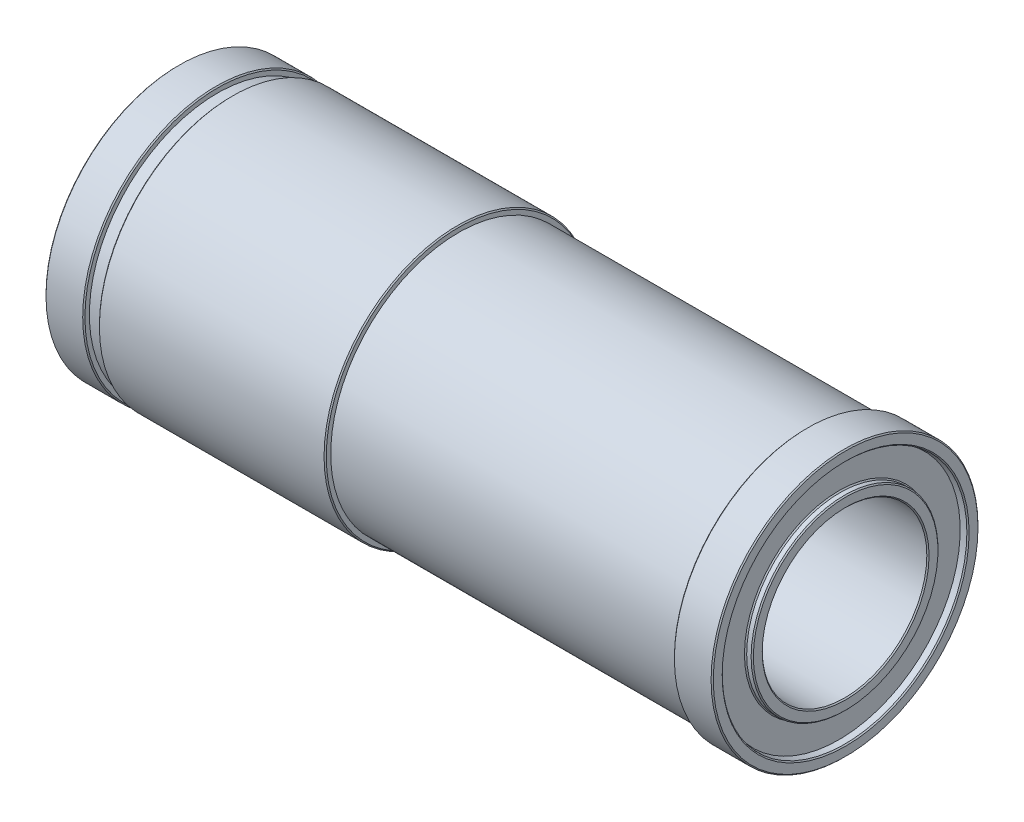
ISO-10303-21;
HEADER;
FILE_DESCRIPTION(('STEP AP214'),'2;1');
FILE_NAME('part.step','',(''),(''),'','','');
FILE_SCHEMA(('AUTOMOTIVE_DESIGN { 1 0 10303 214 1 1 1 1 }'));
ENDSEC;
DATA;
#1=APPLICATION_CONTEXT('core data for automotive mechanical design processes');
#2=APPLICATION_PROTOCOL_DEFINITION('international standard','automotive_design',2000,#1);
#3=PRODUCT_CONTEXT('',#1,'mechanical');
#4=PRODUCT('Part','Part','',(#3));
#5=PRODUCT_RELATED_PRODUCT_CATEGORY('part','',(#4));
#6=PRODUCT_DEFINITION_FORMATION('','',#4);
#7=PRODUCT_DEFINITION_CONTEXT('part definition',#1,'design');
#8=PRODUCT_DEFINITION('design','',#6,#7);
#9=PRODUCT_DEFINITION_SHAPE('','',#8);
#10=(LENGTH_UNIT() NAMED_UNIT(*) SI_UNIT(.MILLI.,.METRE.));
#11=(NAMED_UNIT(*) PLANE_ANGLE_UNIT() SI_UNIT($,.RADIAN.));
#12=(NAMED_UNIT(*) SI_UNIT($,.STERADIAN.) SOLID_ANGLE_UNIT());
#13=UNCERTAINTY_MEASURE_WITH_UNIT(LENGTH_MEASURE(1.E-05),#10,'distance_accuracy_value','');
#14=(GEOMETRIC_REPRESENTATION_CONTEXT(3) GLOBAL_UNCERTAINTY_ASSIGNED_CONTEXT((#13)) GLOBAL_UNIT_ASSIGNED_CONTEXT((#10,
#11,#12)) REPRESENTATION_CONTEXT('',''));
#15=CARTESIAN_POINT('',(0.,0.,0.));
#16=DIRECTION('',(0.,0.,1.));
#17=DIRECTION('',(1.,0.,0.));
#18=AXIS2_PLACEMENT_3D('',#15,#16,#17);
#19=CARTESIAN_POINT('',(0.,-3.00000000002488,0.));
#20=DIRECTION('',(-1.,0.,0.));
#21=DIRECTION('',(0.,0.,1.));
#22=AXIS2_PLACEMENT_3D('',#19,#20,#21);
#23=CONICAL_SURFACE('',#22,7.5,0.785398163397435);
#24=CARTESIAN_POINT('',(0.0999999998896328,-3.00000000002488,0.));
#25=DIRECTION('',(-1.,0.,0.));
#26=DIRECTION('',(0.,0.,1.));
#27=AXIS2_PLACEMENT_3D('',#24,#25,#26);
#28=CIRCLE('',#27,7.40000000011037);
#29=CARTESIAN_POINT('',(0.0999999998896328,-3.00000000002488,7.40000000011037));
#30=VERTEX_POINT('',#29);
#31=EDGE_CURVE('E91',#30,#30,#28,.T.);
#32=ORIENTED_EDGE('',*,*,#31,.F.);
#33=EDGE_LOOP('',(#32));
#34=FACE_BOUND('',#33,.T.);
#35=CARTESIAN_POINT('',(0.,-3.00000000002488,0.));
#36=DIRECTION('',(-1.,0.,0.));
#37=DIRECTION('',(0.,0.,1.));
#38=AXIS2_PLACEMENT_3D('',#35,#36,#37);
#39=CIRCLE('',#38,7.5);
#40=CARTESIAN_POINT('',(0.,-3.00000000002488,7.5));
#41=VERTEX_POINT('',#40);
#42=EDGE_CURVE('E11',#41,#41,#39,.T.);
#43=ORIENTED_EDGE('',*,*,#42,.T.);
#44=EDGE_LOOP('',(#43));
#45=FACE_BOUND('',#44,.T.);
#46=ADVANCED_FACE('F45',(#34,#45),#23,.F.);
#47=CARTESIAN_POINT('',(0.,4.49999999997512,0.));
#48=DIRECTION('',(1.,0.,0.));
#49=DIRECTION('',(0.,0.,-1.));
#50=AXIS2_PLACEMENT_3D('',#47,#48,#49);
#51=PLANE('',#50);
#52=ORIENTED_EDGE('',*,*,#42,.F.);
#53=EDGE_LOOP('',(#52));
#54=FACE_BOUND('',#53,.T.);
#55=CARTESIAN_POINT('',(0.,-3.00000000002488,0.));
#56=DIRECTION('',(-1.,0.,0.));
#57=DIRECTION('',(0.,0.,1.));
#58=AXIS2_PLACEMENT_3D('',#55,#56,#57);
#59=CIRCLE('',#58,8.30000000002656);
#60=CARTESIAN_POINT('',(0.,-3.00000000002488,8.30000000002656));
#61=VERTEX_POINT('',#60);
#62=EDGE_CURVE('E51',#61,#61,#59,.T.);
#63=ORIENTED_EDGE('',*,*,#62,.T.);
#64=EDGE_LOOP('',(#63));
#65=FACE_BOUND('',#64,.T.);
#66=ADVANCED_FACE('F98',(#54,#65),#51,.F.);
#67=CARTESIAN_POINT('',(0.10000000001336,-3.00000000002488,0.));
#68=DIRECTION('',(1.,0.,0.));
#69=DIRECTION('',(0.,0.,-1.));
#70=AXIS2_PLACEMENT_3D('',#67,#68,#69);
#71=CONICAL_SURFACE('',#70,8.40000000003992,0.785398163397466);
#72=ORIENTED_EDGE('',*,*,#62,.F.);
#73=EDGE_LOOP('',(#72));
#74=FACE_BOUND('',#73,.T.);
#75=CARTESIAN_POINT('',(0.10000000001336,-3.00000000002488,0.));
#76=DIRECTION('',(-1.,0.,0.));
#77=DIRECTION('',(0.,0.,1.));
#78=AXIS2_PLACEMENT_3D('',#75,#76,#77);
#79=CIRCLE('',#78,8.40000000003992);
#80=CARTESIAN_POINT('',(0.10000000001336,-3.00000000002488,8.40000000003992));
#81=VERTEX_POINT('',#80);
#82=EDGE_CURVE('E55',#81,#81,#79,.T.);
#83=ORIENTED_EDGE('',*,*,#82,.T.);
#84=EDGE_LOOP('',(#83));
#85=FACE_BOUND('',#84,.T.);
#86=ADVANCED_FACE('F102',(#74,#85),#71,.T.);
#87=CARTESIAN_POINT('',(30.,-3.00000000002488,0.));
#88=DIRECTION('',(-1.,0.,0.));
#89=DIRECTION('',(0.,0.,1.));
#90=AXIS2_PLACEMENT_3D('',#87,#88,#89);
#91=CYLINDRICAL_SURFACE('',#90,8.40000000003992);
#92=ORIENTED_EDGE('',*,*,#82,.F.);
#93=EDGE_LOOP('',(#92));
#94=FACE_BOUND('',#93,.T.);
#95=CARTESIAN_POINT('',(0.500000000013379,-3.00000000002488,0.));
#96=DIRECTION('',(-1.,0.,0.));
#97=DIRECTION('',(0.,0.,1.));
#98=AXIS2_PLACEMENT_3D('',#95,#96,#97);
#99=CIRCLE('',#98,8.40000000003992);
#100=CARTESIAN_POINT('',(0.500000000013379,-3.00000000002488,8.40000000003992));
#101=VERTEX_POINT('',#100);
#102=EDGE_CURVE('E59',#101,#101,#99,.T.);
#103=ORIENTED_EDGE('',*,*,#102,.T.);
#104=EDGE_LOOP('',(#103));
#105=FACE_BOUND('',#104,.T.);
#106=ADVANCED_FACE('F107',(#94,#105),#91,.T.);
#107=CARTESIAN_POINT('',(0.600000000013375,-3.00000000002488,0.));
#108=DIRECTION('',(1.,0.,0.));
#109=DIRECTION('',(0.,0.,-1.));
#110=AXIS2_PLACEMENT_3D('',#107,#108,#109);
#111=CONICAL_SURFACE('',#110,8.50000000003992,0.785398163397448);
#112=ORIENTED_EDGE('',*,*,#102,.F.);
#113=EDGE_LOOP('',(#112));
#114=FACE_BOUND('',#113,.T.);
#115=CARTESIAN_POINT('',(0.600000000013375,-3.00000000002488,0.));
#116=DIRECTION('',(-1.,0.,0.));
#117=DIRECTION('',(0.,0.,1.));
#118=AXIS2_PLACEMENT_3D('',#115,#116,#117);
#119=CIRCLE('',#118,8.50000000003992);
#120=CARTESIAN_POINT('',(0.600000000013375,-3.00000000002488,8.50000000003992));
#121=VERTEX_POINT('',#120);
#122=EDGE_CURVE('E64',#121,#121,#119,.T.);
#123=ORIENTED_EDGE('',*,*,#122,.T.);
#124=EDGE_LOOP('',(#123));
#125=FACE_BOUND('',#124,.T.);
#126=ADVANCED_FACE('F113',(#114,#125),#111,.T.);
#127=CARTESIAN_POINT('',(0.600000000013375,5.50000000001504,0.));
#128=DIRECTION('',(1.,0.,0.));
#129=DIRECTION('',(0.,0.,-1.));
#130=AXIS2_PLACEMENT_3D('',#127,#128,#129);
#131=PLANE('',#130);
#132=ORIENTED_EDGE('',*,*,#122,.F.);
#133=EDGE_LOOP('',(#132));
#134=FACE_BOUND('',#133,.T.);
#135=CARTESIAN_POINT('',(0.600000000013375,-3.00000000002488,0.));
#136=DIRECTION('',(-1.,0.,0.));
#137=DIRECTION('',(0.,0.,1.));
#138=AXIS2_PLACEMENT_3D('',#135,#136,#137);
#139=CIRCLE('',#138,10.9000000000249);
#140=CARTESIAN_POINT('',(0.600000000013375,-3.00000000002488,10.9000000000249));
#141=VERTEX_POINT('',#140);
#142=EDGE_CURVE('E67',#141,#141,#139,.T.);
#143=ORIENTED_EDGE('',*,*,#142,.T.);
#144=EDGE_LOOP('',(#143));
#145=FACE_BOUND('',#144,.T.);
#146=ADVANCED_FACE('F117',(#134,#145),#131,.F.);
#147=CARTESIAN_POINT('',(30.,-3.00000000002488,0.));
#148=DIRECTION('',(-1.,0.,0.));
#149=DIRECTION('',(0.,0.,1.));
#150=AXIS2_PLACEMENT_3D('',#147,#148,#149);
#151=CYLINDRICAL_SURFACE('',#150,10.9000000000249);
#152=ORIENTED_EDGE('',*,*,#142,.F.);
#153=EDGE_LOOP('',(#152));
#154=FACE_BOUND('',#153,.T.);
#155=CARTESIAN_POINT('',(59.3999999998077,-3.00000000002488,0.));
#156=DIRECTION('',(-1.,0.,0.));
#157=DIRECTION('',(0.,0.,1.));
#158=AXIS2_PLACEMENT_3D('',#155,#156,#157);
#159=CIRCLE('',#158,10.9000000000249);
#160=CARTESIAN_POINT('',(59.3999999998077,-3.00000000002488,10.9000000000249));
#161=VERTEX_POINT('',#160);
#162=EDGE_CURVE('E70',#161,#161,#159,.T.);
#163=ORIENTED_EDGE('',*,*,#162,.T.);
#164=EDGE_LOOP('',(#163));
#165=FACE_BOUND('',#164,.T.);
#166=ADVANCED_FACE('F121',(#154,#165),#151,.T.);
#167=CARTESIAN_POINT('',(59.3999999998077,7.9,0.));
#168=DIRECTION('',(-1.,0.,0.));
#169=DIRECTION('',(0.,0.,1.));
#170=AXIS2_PLACEMENT_3D('',#167,#168,#169);
#171=PLANE('',#170);
#172=ORIENTED_EDGE('',*,*,#162,.F.);
#173=EDGE_LOOP('',(#172));
#174=FACE_BOUND('',#173,.T.);
#175=CARTESIAN_POINT('',(59.3999999998077,-3.00000000002488,0.));
#176=DIRECTION('',(-1.,0.,0.));
#177=DIRECTION('',(0.,0.,1.));
#178=AXIS2_PLACEMENT_3D('',#175,#176,#177);
#179=CIRCLE('',#178,8.50000000002487);
#180=CARTESIAN_POINT('',(59.3999999998077,-3.00000000002488,8.50000000002487));
#181=VERTEX_POINT('',#180);
#182=EDGE_CURVE('E73',#181,#181,#179,.T.);
#183=ORIENTED_EDGE('',*,*,#182,.T.);
#184=EDGE_LOOP('',(#183));
#185=FACE_BOUND('',#184,.T.);
#186=ADVANCED_FACE('F125',(#174,#185),#171,.F.);
#187=CARTESIAN_POINT('',(59.4999999998077,-3.00000000002488,0.));
#188=DIRECTION('',(-1.,0.,0.));
#189=DIRECTION('',(0.,0.,1.));
#190=AXIS2_PLACEMENT_3D('',#187,#188,#189);
#191=CONICAL_SURFACE('',#190,8.40000000002487,0.785398163397466);
#192=ORIENTED_EDGE('',*,*,#182,.F.);
#193=EDGE_LOOP('',(#192));
#194=FACE_BOUND('',#193,.T.);
#195=CARTESIAN_POINT('',(59.4999999998077,-3.00000000002488,0.));
#196=DIRECTION('',(-1.,0.,0.));
#197=DIRECTION('',(0.,0.,1.));
#198=AXIS2_PLACEMENT_3D('',#195,#196,#197);
#199=CIRCLE('',#198,8.40000000002487);
#200=CARTESIAN_POINT('',(59.4999999998077,-3.00000000002488,8.40000000002487));
#201=VERTEX_POINT('',#200);
#202=EDGE_CURVE('E76',#201,#201,#199,.T.);
#203=ORIENTED_EDGE('',*,*,#202,.T.);
#204=EDGE_LOOP('',(#203));
#205=FACE_BOUND('',#204,.T.);
#206=ADVANCED_FACE('F129',(#194,#205),#191,.T.);
#207=CARTESIAN_POINT('',(30.,-3.00000000002488,0.));
#208=DIRECTION('',(-1.,0.,0.));
#209=DIRECTION('',(0.,0.,1.));
#210=AXIS2_PLACEMENT_3D('',#207,#208,#209);
#211=CYLINDRICAL_SURFACE('',#210,8.40000000002487);
#212=ORIENTED_EDGE('',*,*,#202,.F.);
#213=EDGE_LOOP('',(#212));
#214=FACE_BOUND('',#213,.T.);
#215=CARTESIAN_POINT('',(59.8999999998077,-3.00000000002488,0.));
#216=DIRECTION('',(-1.,0.,0.));
#217=DIRECTION('',(0.,0.,1.));
#218=AXIS2_PLACEMENT_3D('',#215,#216,#217);
#219=CIRCLE('',#218,8.40000000002487);
#220=CARTESIAN_POINT('',(59.8999999998077,-3.00000000002488,8.40000000002487));
#221=VERTEX_POINT('',#220);
#222=EDGE_CURVE('E79',#221,#221,#219,.T.);
#223=ORIENTED_EDGE('',*,*,#222,.T.);
#224=EDGE_LOOP('',(#223));
#225=FACE_BOUND('',#224,.T.);
#226=ADVANCED_FACE('F133',(#214,#225),#211,.T.);
#227=CARTESIAN_POINT('',(59.9999999998077,-3.00000000002488,0.));
#228=DIRECTION('',(-1.,0.,0.));
#229=DIRECTION('',(0.,0.,1.));
#230=AXIS2_PLACEMENT_3D('',#227,#228,#229);
#231=CONICAL_SURFACE('',#230,8.30000000002488,0.785398163397431);
#232=ORIENTED_EDGE('',*,*,#222,.F.);
#233=EDGE_LOOP('',(#232));
#234=FACE_BOUND('',#233,.T.);
#235=CARTESIAN_POINT('',(59.9999999998077,-3.00000000002488,0.));
#236=DIRECTION('',(-1.,0.,0.));
#237=DIRECTION('',(0.,0.,1.));
#238=AXIS2_PLACEMENT_3D('',#235,#236,#237);
#239=CIRCLE('',#238,8.30000000002488);
#240=CARTESIAN_POINT('',(59.9999999998077,-3.00000000002488,8.30000000002488));
#241=VERTEX_POINT('',#240);
#242=EDGE_CURVE('E82',#241,#241,#239,.T.);
#243=ORIENTED_EDGE('',*,*,#242,.T.);
#244=EDGE_LOOP('',(#243));
#245=FACE_BOUND('',#244,.T.);
#246=ADVANCED_FACE('F137',(#234,#245),#231,.T.);
#247=CARTESIAN_POINT('',(59.9999999998077,5.3,0.));
#248=DIRECTION('',(-1.,0.,0.));
#249=DIRECTION('',(0.,0.,1.));
#250=AXIS2_PLACEMENT_3D('',#247,#248,#249);
#251=PLANE('',#250);
#252=ORIENTED_EDGE('',*,*,#242,.F.);
#253=EDGE_LOOP('',(#252));
#254=FACE_BOUND('',#253,.T.);
#255=CARTESIAN_POINT('',(59.9999999998077,-3.00000000002488,0.));
#256=DIRECTION('',(-1.,0.,0.));
#257=DIRECTION('',(0.,0.,1.));
#258=AXIS2_PLACEMENT_3D('',#255,#256,#257);
#259=CIRCLE('',#258,7.50000000002842);
#260=CARTESIAN_POINT('',(59.9999999998077,-3.00000000002488,7.50000000002842));
#261=VERTEX_POINT('',#260);
#262=EDGE_CURVE('E85',#261,#261,#259,.T.);
#263=ORIENTED_EDGE('',*,*,#262,.T.);
#264=EDGE_LOOP('',(#263));
#265=FACE_BOUND('',#264,.T.);
#266=ADVANCED_FACE('F141',(#254,#265),#251,.F.);
#267=CARTESIAN_POINT('',(59.8999999998896,-3.00000000002488,0.));
#268=DIRECTION('',(1.,0.,0.));
#269=DIRECTION('',(0.,0.,-1.));
#270=AXIS2_PLACEMENT_3D('',#267,#268,#269);
#271=CONICAL_SURFACE('',#270,7.40000000011036,0.78539816339744);
#272=ORIENTED_EDGE('',*,*,#262,.F.);
#273=EDGE_LOOP('',(#272));
#274=FACE_BOUND('',#273,.T.);
#275=CARTESIAN_POINT('',(59.8999999998896,-3.00000000002488,0.));
#276=DIRECTION('',(-1.,0.,0.));
#277=DIRECTION('',(0.,0.,1.));
#278=AXIS2_PLACEMENT_3D('',#275,#276,#277);
#279=CIRCLE('',#278,7.40000000011036);
#280=CARTESIAN_POINT('',(59.8999999998896,-3.00000000002488,7.40000000011036));
#281=VERTEX_POINT('',#280);
#282=EDGE_CURVE('E88',#281,#281,#279,.T.);
#283=ORIENTED_EDGE('',*,*,#282,.T.);
#284=EDGE_LOOP('',(#283));
#285=FACE_BOUND('',#284,.T.);
#286=ADVANCED_FACE('F145',(#274,#285),#271,.F.);
#287=CARTESIAN_POINT('',(30.,-3.00000000002488,0.));
#288=DIRECTION('',(-1.,0.,0.));
#289=DIRECTION('',(0.,0.,1.));
#290=AXIS2_PLACEMENT_3D('',#287,#288,#289);
#291=CYLINDRICAL_SURFACE('',#290,7.40000000011037);
#292=ORIENTED_EDGE('',*,*,#282,.F.);
#293=EDGE_LOOP('',(#292));
#294=FACE_BOUND('',#293,.T.);
#295=ORIENTED_EDGE('',*,*,#31,.T.);
#296=EDGE_LOOP('',(#295));
#297=FACE_BOUND('',#296,.T.);
#298=ADVANCED_FACE('F95',(#294,#297),#291,.F.);
#299=CLOSED_SHELL('',(#46,#66,#86,#106,#126,#146,#166,#186,#206,#226,#246,#266,#286,#298));
#300=MANIFOLD_SOLID_BREP('B2',#299);
#301=CARTESIAN_POINT('',(25.2,8.5,0.));
#302=DIRECTION('',(1.,0.,0.));
#303=DIRECTION('',(0.,0.,-1.));
#304=AXIS2_PLACEMENT_3D('',#301,#302,#303);
#305=PLANE('',#304);
#306=CARTESIAN_POINT('',(25.2,-3.,0.));
#307=DIRECTION('',(1.,0.,0.));
#308=DIRECTION('',(0.,0.,-1.));
#309=AXIS2_PLACEMENT_3D('',#306,#307,#308);
#310=CIRCLE('',#309,11.9);
#311=CARTESIAN_POINT('',(25.2,-3.,-11.9));
#312=VERTEX_POINT('',#311);
#313=EDGE_CURVE('E44',#312,#312,#310,.T.);
#314=ORIENTED_EDGE('',*,*,#313,.T.);
#315=EDGE_LOOP('',(#314));
#316=FACE_BOUND('',#315,.T.);
#317=CARTESIAN_POINT('',(25.2,-3.,0.));
#318=DIRECTION('',(1.,0.,0.));
#319=DIRECTION('',(0.,0.,-1.));
#320=AXIS2_PLACEMENT_3D('',#317,#318,#319);
#321=CIRCLE('',#320,11.5);
#322=CARTESIAN_POINT('',(25.2,-3.,-11.5));
#323=VERTEX_POINT('',#322);
#324=EDGE_CURVE('E318',#323,#323,#321,.T.);
#325=ORIENTED_EDGE('',*,*,#324,.F.);
#326=EDGE_LOOP('',(#325));
#327=FACE_BOUND('',#326,.T.);
#328=ADVANCED_FACE('F257',(#316,#327),#305,.T.);
#329=CARTESIAN_POINT('',(25.2,-3.,0.));
#330=DIRECTION('',(-1.,0.,0.));
#331=DIRECTION('',(0.,0.,1.));
#332=AXIS2_PLACEMENT_3D('',#329,#330,#331);
#333=CONICAL_SURFACE('',#332,11.9,0.785398163397466);
#334=CARTESIAN_POINT('',(25.1,-3.,0.));
#335=DIRECTION('',(1.,0.,0.));
#336=DIRECTION('',(0.,0.,-1.));
#337=AXIS2_PLACEMENT_3D('',#334,#335,#336);
#338=CIRCLE('',#337,12.);
#339=CARTESIAN_POINT('',(25.1,-3.,-12.));
#340=VERTEX_POINT('',#339);
#341=EDGE_CURVE('E263',#340,#340,#338,.T.);
#342=ORIENTED_EDGE('',*,*,#341,.T.);
#343=EDGE_LOOP('',(#342));
#344=FACE_BOUND('',#343,.T.);
#345=ORIENTED_EDGE('',*,*,#313,.F.);
#346=EDGE_LOOP('',(#345));
#347=FACE_BOUND('',#346,.T.);
#348=ADVANCED_FACE('F326',(#344,#347),#333,.T.);
#349=CARTESIAN_POINT('',(0.,-3.,0.));
#350=DIRECTION('',(1.,0.,0.));
#351=DIRECTION('',(0.,0.,-1.));
#352=AXIS2_PLACEMENT_3D('',#349,#350,#351);
#353=CYLINDRICAL_SURFACE('',#352,12.);
#354=CARTESIAN_POINT('',(4.89999999999999,-3.,0.));
#355=DIRECTION('',(1.,0.,0.));
#356=DIRECTION('',(0.,0.,-1.));
#357=AXIS2_PLACEMENT_3D('',#354,#355,#356);
#358=CIRCLE('',#357,12.);
#359=CARTESIAN_POINT('',(4.89999999999999,-3.,-12.));
#360=VERTEX_POINT('',#359);
#361=EDGE_CURVE('E267',#360,#360,#358,.T.);
#362=ORIENTED_EDGE('',*,*,#361,.T.);
#363=EDGE_LOOP('',(#362));
#364=FACE_BOUND('',#363,.T.);
#365=ORIENTED_EDGE('',*,*,#341,.F.);
#366=EDGE_LOOP('',(#365));
#367=FACE_BOUND('',#366,.T.);
#368=ADVANCED_FACE('F330',(#364,#367),#353,.T.);
#369=CARTESIAN_POINT('',(4.89999999999999,-3.,0.));
#370=DIRECTION('',(1.,0.,0.));
#371=DIRECTION('',(0.,0.,-1.));
#372=AXIS2_PLACEMENT_3D('',#369,#370,#371);
#373=CONICAL_SURFACE('',#372,12.,0.78539816339744);
#374=CARTESIAN_POINT('',(4.8,-3.,0.));
#375=DIRECTION('',(1.,0.,0.));
#376=DIRECTION('',(0.,0.,-1.));
#377=AXIS2_PLACEMENT_3D('',#374,#375,#376);
#378=CIRCLE('',#377,11.9);
#379=CARTESIAN_POINT('',(4.8,-3.,-11.9));
#380=VERTEX_POINT('',#379);
#381=EDGE_CURVE('E271',#380,#380,#378,.T.);
#382=ORIENTED_EDGE('',*,*,#381,.T.);
#383=EDGE_LOOP('',(#382));
#384=FACE_BOUND('',#383,.T.);
#385=ORIENTED_EDGE('',*,*,#361,.F.);
#386=EDGE_LOOP('',(#385));
#387=FACE_BOUND('',#386,.T.);
#388=ADVANCED_FACE('F334',(#384,#387),#373,.T.);
#389=CARTESIAN_POINT('',(4.8,8.90000000000001,0.));
#390=DIRECTION('',(-1.,0.,0.));
#391=DIRECTION('',(0.,0.,1.));
#392=AXIS2_PLACEMENT_3D('',#389,#390,#391);
#393=PLANE('',#392);
#394=CARTESIAN_POINT('',(4.8,-3.,0.));
#395=DIRECTION('',(1.,0.,0.));
#396=DIRECTION('',(0.,0.,-1.));
#397=AXIS2_PLACEMENT_3D('',#394,#395,#396);
#398=CIRCLE('',#397,11.5);
#399=CARTESIAN_POINT('',(4.8,-3.,-11.5));
#400=VERTEX_POINT('',#399);
#401=EDGE_CURVE('E276',#400,#400,#398,.T.);
#402=ORIENTED_EDGE('',*,*,#401,.T.);
#403=EDGE_LOOP('',(#402));
#404=FACE_BOUND('',#403,.T.);
#405=ORIENTED_EDGE('',*,*,#381,.F.);
#406=EDGE_LOOP('',(#405));
#407=FACE_BOUND('',#406,.T.);
#408=ADVANCED_FACE('F341',(#404,#407),#393,.T.);
#409=CARTESIAN_POINT('',(0.,-3.,0.));
#410=DIRECTION('',(1.,0.,0.));
#411=DIRECTION('',(0.,0.,-1.));
#412=AXIS2_PLACEMENT_3D('',#409,#410,#411);
#413=CYLINDRICAL_SURFACE('',#412,11.5);
#414=CARTESIAN_POINT('',(3.5,-3.,0.));
#415=DIRECTION('',(1.,0.,0.));
#416=DIRECTION('',(0.,0.,-1.));
#417=AXIS2_PLACEMENT_3D('',#414,#415,#416);
#418=CIRCLE('',#417,11.5);
#419=CARTESIAN_POINT('',(3.5,-3.,-11.5));
#420=VERTEX_POINT('',#419);
#421=EDGE_CURVE('E279',#420,#420,#418,.T.);
#422=ORIENTED_EDGE('',*,*,#421,.T.);
#423=EDGE_LOOP('',(#422));
#424=FACE_BOUND('',#423,.T.);
#425=ORIENTED_EDGE('',*,*,#401,.F.);
#426=EDGE_LOOP('',(#425));
#427=FACE_BOUND('',#426,.T.);
#428=ADVANCED_FACE('F345',(#424,#427),#413,.T.);
#429=CARTESIAN_POINT('',(3.5,8.5,0.));
#430=DIRECTION('',(1.,0.,0.));
#431=DIRECTION('',(0.,0.,-1.));
#432=AXIS2_PLACEMENT_3D('',#429,#430,#431);
#433=PLANE('',#432);
#434=CARTESIAN_POINT('',(3.5,-3.,0.));
#435=DIRECTION('',(1.,0.,0.));
#436=DIRECTION('',(0.,0.,-1.));
#437=AXIS2_PLACEMENT_3D('',#434,#435,#436);
#438=CIRCLE('',#437,11.9);
#439=CARTESIAN_POINT('',(3.5,-3.,-11.9));
#440=VERTEX_POINT('',#439);
#441=EDGE_CURVE('E282',#440,#440,#438,.T.);
#442=ORIENTED_EDGE('',*,*,#441,.T.);
#443=EDGE_LOOP('',(#442));
#444=FACE_BOUND('',#443,.T.);
#445=ORIENTED_EDGE('',*,*,#421,.F.);
#446=EDGE_LOOP('',(#445));
#447=FACE_BOUND('',#446,.T.);
#448=ADVANCED_FACE('F349',(#444,#447),#433,.T.);
#449=CARTESIAN_POINT('',(3.5,-3.,0.));
#450=DIRECTION('',(-1.,0.,0.));
#451=DIRECTION('',(0.,0.,1.));
#452=AXIS2_PLACEMENT_3D('',#449,#450,#451);
#453=CONICAL_SURFACE('',#452,11.9,0.785398163397446);
#454=CARTESIAN_POINT('',(3.4,-3.,0.));
#455=DIRECTION('',(1.,0.,0.));
#456=DIRECTION('',(0.,0.,-1.));
#457=AXIS2_PLACEMENT_3D('',#454,#455,#456);
#458=CIRCLE('',#457,12.);
#459=CARTESIAN_POINT('',(3.4,-3.,-12.));
#460=VERTEX_POINT('',#459);
#461=EDGE_CURVE('E285',#460,#460,#458,.T.);
#462=ORIENTED_EDGE('',*,*,#461,.T.);
#463=EDGE_LOOP('',(#462));
#464=FACE_BOUND('',#463,.T.);
#465=ORIENTED_EDGE('',*,*,#441,.F.);
#466=EDGE_LOOP('',(#465));
#467=FACE_BOUND('',#466,.T.);
#468=ADVANCED_FACE('F353',(#464,#467),#453,.T.);
#469=CARTESIAN_POINT('',(0.,-3.,0.));
#470=DIRECTION('',(1.,0.,0.));
#471=DIRECTION('',(0.,0.,-1.));
#472=AXIS2_PLACEMENT_3D('',#469,#470,#471);
#473=CYLINDRICAL_SURFACE('',#472,12.);
#474=CARTESIAN_POINT('',(0.0999999999999946,-3.,0.));
#475=DIRECTION('',(1.,0.,0.));
#476=DIRECTION('',(0.,0.,-1.));
#477=AXIS2_PLACEMENT_3D('',#474,#475,#476);
#478=CIRCLE('',#477,12.);
#479=CARTESIAN_POINT('',(0.0999999999999946,-3.,-12.));
#480=VERTEX_POINT('',#479);
#481=EDGE_CURVE('E288',#480,#480,#478,.T.);
#482=ORIENTED_EDGE('',*,*,#481,.T.);
#483=EDGE_LOOP('',(#482));
#484=FACE_BOUND('',#483,.T.);
#485=ORIENTED_EDGE('',*,*,#461,.F.);
#486=EDGE_LOOP('',(#485));
#487=FACE_BOUND('',#486,.T.);
#488=ADVANCED_FACE('F357',(#484,#487),#473,.T.);
#489=CARTESIAN_POINT('',(0.0999999999999946,-3.,0.));
#490=DIRECTION('',(1.,0.,0.));
#491=DIRECTION('',(0.,0.,-1.));
#492=AXIS2_PLACEMENT_3D('',#489,#490,#491);
#493=CONICAL_SURFACE('',#492,12.,0.785398163397454);
#494=CARTESIAN_POINT('',(0.,-3.,0.));
#495=DIRECTION('',(1.,0.,0.));
#496=DIRECTION('',(0.,0.,-1.));
#497=AXIS2_PLACEMENT_3D('',#494,#495,#496);
#498=CIRCLE('',#497,11.9);
#499=CARTESIAN_POINT('',(0.,-3.,-11.9));
#500=VERTEX_POINT('',#499);
#501=EDGE_CURVE('E291',#500,#500,#498,.T.);
#502=ORIENTED_EDGE('',*,*,#501,.T.);
#503=EDGE_LOOP('',(#502));
#504=FACE_BOUND('',#503,.T.);
#505=ORIENTED_EDGE('',*,*,#481,.F.);
#506=EDGE_LOOP('',(#505));
#507=FACE_BOUND('',#506,.T.);
#508=ADVANCED_FACE('F361',(#504,#507),#493,.T.);
#509=CARTESIAN_POINT('',(0.,8.9,0.));
#510=DIRECTION('',(-1.,0.,0.));
#511=DIRECTION('',(0.,0.,1.));
#512=AXIS2_PLACEMENT_3D('',#509,#510,#511);
#513=PLANE('',#512);
#514=CARTESIAN_POINT('',(0.,-3.,0.));
#515=DIRECTION('',(1.,0.,0.));
#516=DIRECTION('',(0.,0.,-1.));
#517=AXIS2_PLACEMENT_3D('',#514,#515,#516);
#518=CIRCLE('',#517,11.);
#519=CARTESIAN_POINT('',(0.,-3.,-11.));
#520=VERTEX_POINT('',#519);
#521=EDGE_CURVE('E294',#520,#520,#518,.T.);
#522=ORIENTED_EDGE('',*,*,#521,.T.);
#523=EDGE_LOOP('',(#522));
#524=FACE_BOUND('',#523,.T.);
#525=ORIENTED_EDGE('',*,*,#501,.F.);
#526=EDGE_LOOP('',(#525));
#527=FACE_BOUND('',#526,.T.);
#528=ADVANCED_FACE('F365',(#524,#527),#513,.T.);
#529=CARTESIAN_POINT('',(0.,-3.,0.));
#530=DIRECTION('',(1.,0.,0.));
#531=DIRECTION('',(0.,0.,-1.));
#532=AXIS2_PLACEMENT_3D('',#529,#530,#531);
#533=CYLINDRICAL_SURFACE('',#532,11.);
#534=CARTESIAN_POINT('',(59.9,-3.,0.));
#535=DIRECTION('',(1.,0.,0.));
#536=DIRECTION('',(0.,0.,-1.));
#537=AXIS2_PLACEMENT_3D('',#534,#535,#536);
#538=CIRCLE('',#537,11.);
#539=CARTESIAN_POINT('',(59.9,-3.,-11.));
#540=VERTEX_POINT('',#539);
#541=EDGE_CURVE('E297',#540,#540,#538,.T.);
#542=ORIENTED_EDGE('',*,*,#541,.T.);
#543=EDGE_LOOP('',(#542));
#544=FACE_BOUND('',#543,.T.);
#545=ORIENTED_EDGE('',*,*,#521,.F.);
#546=EDGE_LOOP('',(#545));
#547=FACE_BOUND('',#546,.T.);
#548=ADVANCED_FACE('F369',(#544,#547),#533,.F.);
#549=CARTESIAN_POINT('',(59.9,-3.,0.));
#550=DIRECTION('',(1.,0.,0.));
#551=DIRECTION('',(0.,0.,-1.));
#552=AXIS2_PLACEMENT_3D('',#549,#550,#551);
#553=CONICAL_SURFACE('',#552,11.,0.785398163397431);
#554=CARTESIAN_POINT('',(60.,-3.,0.));
#555=DIRECTION('',(1.,0.,0.));
#556=DIRECTION('',(0.,0.,-1.));
#557=AXIS2_PLACEMENT_3D('',#554,#555,#556);
#558=CIRCLE('',#557,11.1);
#559=CARTESIAN_POINT('',(60.,-3.,-11.1));
#560=VERTEX_POINT('',#559);
#561=EDGE_CURVE('E300',#560,#560,#558,.T.);
#562=ORIENTED_EDGE('',*,*,#561,.T.);
#563=EDGE_LOOP('',(#562));
#564=FACE_BOUND('',#563,.T.);
#565=ORIENTED_EDGE('',*,*,#541,.F.);
#566=EDGE_LOOP('',(#565));
#567=FACE_BOUND('',#566,.T.);
#568=ADVANCED_FACE('F373',(#564,#567),#553,.F.);
#569=CARTESIAN_POINT('',(60.,8.1,0.));
#570=DIRECTION('',(1.,0.,0.));
#571=DIRECTION('',(0.,0.,-1.));
#572=AXIS2_PLACEMENT_3D('',#569,#570,#571);
#573=PLANE('',#572);
#574=CARTESIAN_POINT('',(60.,-3.,0.));
#575=DIRECTION('',(1.,0.,0.));
#576=DIRECTION('',(0.,0.,-1.));
#577=AXIS2_PLACEMENT_3D('',#574,#575,#576);
#578=CIRCLE('',#577,11.9);
#579=CARTESIAN_POINT('',(60.,-3.,-11.9));
#580=VERTEX_POINT('',#579);
#581=EDGE_CURVE('E303',#580,#580,#578,.T.);
#582=ORIENTED_EDGE('',*,*,#581,.T.);
#583=EDGE_LOOP('',(#582));
#584=FACE_BOUND('',#583,.T.);
#585=ORIENTED_EDGE('',*,*,#561,.F.);
#586=EDGE_LOOP('',(#585));
#587=FACE_BOUND('',#586,.T.);
#588=ADVANCED_FACE('F377',(#584,#587),#573,.T.);
#589=CARTESIAN_POINT('',(60.,-3.,0.));
#590=DIRECTION('',(-1.,0.,0.));
#591=DIRECTION('',(0.,0.,1.));
#592=AXIS2_PLACEMENT_3D('',#589,#590,#591);
#593=CONICAL_SURFACE('',#592,11.9,0.785398163397457);
#594=CARTESIAN_POINT('',(59.9,-3.,0.));
#595=DIRECTION('',(1.,0.,0.));
#596=DIRECTION('',(0.,0.,-1.));
#597=AXIS2_PLACEMENT_3D('',#594,#595,#596);
#598=CIRCLE('',#597,12.);
#599=CARTESIAN_POINT('',(59.9,-3.,-12.));
#600=VERTEX_POINT('',#599);
#601=EDGE_CURVE('E306',#600,#600,#598,.T.);
#602=ORIENTED_EDGE('',*,*,#601,.T.);
#603=EDGE_LOOP('',(#602));
#604=FACE_BOUND('',#603,.T.);
#605=ORIENTED_EDGE('',*,*,#581,.F.);
#606=EDGE_LOOP('',(#605));
#607=FACE_BOUND('',#606,.T.);
#608=ADVANCED_FACE('F381',(#604,#607),#593,.T.);
#609=CARTESIAN_POINT('',(0.,-3.,0.));
#610=DIRECTION('',(1.,0.,0.));
#611=DIRECTION('',(0.,0.,-1.));
#612=AXIS2_PLACEMENT_3D('',#609,#610,#611);
#613=CYLINDRICAL_SURFACE('',#612,12.);
#614=CARTESIAN_POINT('',(56.6,-3.,0.));
#615=DIRECTION('',(1.,0.,0.));
#616=DIRECTION('',(0.,0.,-1.));
#617=AXIS2_PLACEMENT_3D('',#614,#615,#616);
#618=CIRCLE('',#617,12.);
#619=CARTESIAN_POINT('',(56.6,-3.,-12.));
#620=VERTEX_POINT('',#619);
#621=EDGE_CURVE('E309',#620,#620,#618,.T.);
#622=ORIENTED_EDGE('',*,*,#621,.T.);
#623=EDGE_LOOP('',(#622));
#624=FACE_BOUND('',#623,.T.);
#625=ORIENTED_EDGE('',*,*,#601,.F.);
#626=EDGE_LOOP('',(#625));
#627=FACE_BOUND('',#626,.T.);
#628=ADVANCED_FACE('F385',(#624,#627),#613,.T.);
#629=CARTESIAN_POINT('',(56.6,-3.,0.));
#630=DIRECTION('',(1.,0.,0.));
#631=DIRECTION('',(0.,0.,-1.));
#632=AXIS2_PLACEMENT_3D('',#629,#630,#631);
#633=CONICAL_SURFACE('',#632,12.,0.785398163397431);
#634=CARTESIAN_POINT('',(56.5,-3.,0.));
#635=DIRECTION('',(1.,0.,0.));
#636=DIRECTION('',(0.,0.,-1.));
#637=AXIS2_PLACEMENT_3D('',#634,#635,#636);
#638=CIRCLE('',#637,11.9);
#639=CARTESIAN_POINT('',(56.5,-3.,-11.9));
#640=VERTEX_POINT('',#639);
#641=EDGE_CURVE('E312',#640,#640,#638,.T.);
#642=ORIENTED_EDGE('',*,*,#641,.T.);
#643=EDGE_LOOP('',(#642));
#644=FACE_BOUND('',#643,.T.);
#645=ORIENTED_EDGE('',*,*,#621,.F.);
#646=EDGE_LOOP('',(#645));
#647=FACE_BOUND('',#646,.T.);
#648=ADVANCED_FACE('F389',(#644,#647),#633,.T.);
#649=CARTESIAN_POINT('',(56.5,8.9,0.));
#650=DIRECTION('',(-1.,0.,0.));
#651=DIRECTION('',(0.,0.,1.));
#652=AXIS2_PLACEMENT_3D('',#649,#650,#651);
#653=PLANE('',#652);
#654=CARTESIAN_POINT('',(56.5,-3.,0.));
#655=DIRECTION('',(1.,0.,0.));
#656=DIRECTION('',(0.,0.,-1.));
#657=AXIS2_PLACEMENT_3D('',#654,#655,#656);
#658=CIRCLE('',#657,11.5);
#659=CARTESIAN_POINT('',(56.5,-3.,-11.5));
#660=VERTEX_POINT('',#659);
#661=EDGE_CURVE('E315',#660,#660,#658,.T.);
#662=ORIENTED_EDGE('',*,*,#661,.T.);
#663=EDGE_LOOP('',(#662));
#664=FACE_BOUND('',#663,.T.);
#665=ORIENTED_EDGE('',*,*,#641,.F.);
#666=EDGE_LOOP('',(#665));
#667=FACE_BOUND('',#666,.T.);
#668=ADVANCED_FACE('F393',(#664,#667),#653,.T.);
#669=CARTESIAN_POINT('',(0.,-3.,0.));
#670=DIRECTION('',(1.,0.,0.));
#671=DIRECTION('',(0.,0.,-1.));
#672=AXIS2_PLACEMENT_3D('',#669,#670,#671);
#673=CYLINDRICAL_SURFACE('',#672,11.5);
#674=ORIENTED_EDGE('',*,*,#324,.T.);
#675=EDGE_LOOP('',(#674));
#676=FACE_BOUND('',#675,.T.);
#677=ORIENTED_EDGE('',*,*,#661,.F.);
#678=EDGE_LOOP('',(#677));
#679=FACE_BOUND('',#678,.T.);
#680=ADVANCED_FACE('F322',(#676,#679),#673,.T.);
#681=CLOSED_SHELL('',(#328,#348,#368,#388,#408,#428,#448,#468,#488,#508,#528,#548,#568,#588,
#608,#628,#648,#668,#680));
#682=MANIFOLD_SOLID_BREP('B6',#681);
#683=ADVANCED_BREP_SHAPE_REPRESENTATION('',(#18,#300,#682),#14);
#684=SHAPE_DEFINITION_REPRESENTATION(#9,#683);
ENDSEC;
END-ISO-10303-21;
